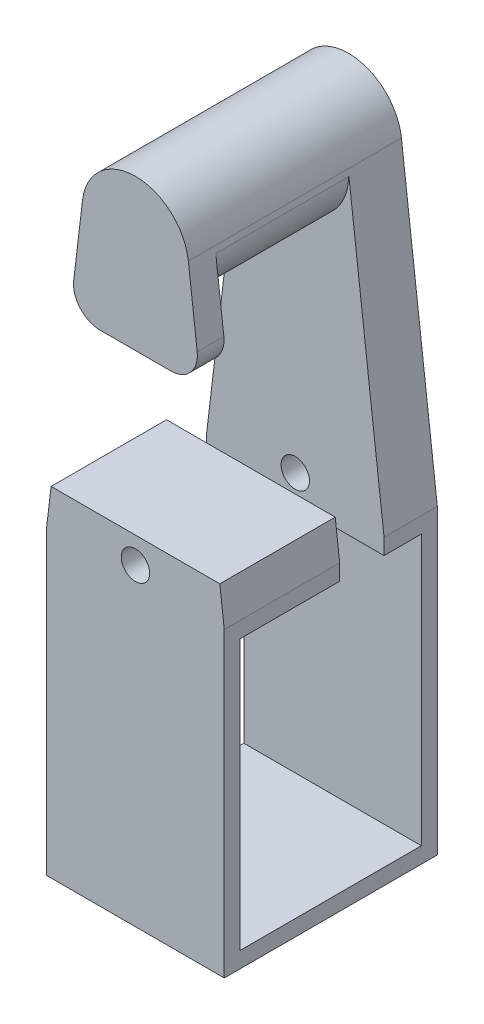
ISO-10303-21;
HEADER;
FILE_DESCRIPTION(('STEP AP214'),'2;1');
FILE_NAME('part.step','',(''),(''),'','','');
FILE_SCHEMA(('AUTOMOTIVE_DESIGN { 1 0 10303 214 1 1 1 1 }'));
ENDSEC;
DATA;
#1=APPLICATION_CONTEXT('core data for automotive mechanical design processes');
#2=APPLICATION_PROTOCOL_DEFINITION('international standard','automotive_design',2000,#1);
#3=PRODUCT_CONTEXT('',#1,'mechanical');
#4=PRODUCT('Part','Part','',(#3));
#5=PRODUCT_RELATED_PRODUCT_CATEGORY('part','',(#4));
#6=PRODUCT_DEFINITION_FORMATION('','',#4);
#7=PRODUCT_DEFINITION_CONTEXT('part definition',#1,'design');
#8=PRODUCT_DEFINITION('design','',#6,#7);
#9=PRODUCT_DEFINITION_SHAPE('','',#8);
#10=(LENGTH_UNIT() NAMED_UNIT(*) SI_UNIT(.MILLI.,.METRE.));
#11=(NAMED_UNIT(*) PLANE_ANGLE_UNIT() SI_UNIT($,.RADIAN.));
#12=(NAMED_UNIT(*) SI_UNIT($,.STERADIAN.) SOLID_ANGLE_UNIT());
#13=UNCERTAINTY_MEASURE_WITH_UNIT(LENGTH_MEASURE(1.E-05),#10,'distance_accuracy_value','');
#14=(GEOMETRIC_REPRESENTATION_CONTEXT(3) GLOBAL_UNCERTAINTY_ASSIGNED_CONTEXT((#13)) GLOBAL_UNIT_ASSIGNED_CONTEXT((#10,
#11,#12)) REPRESENTATION_CONTEXT('',''));
#15=CARTESIAN_POINT('',(0.,0.,0.));
#16=DIRECTION('',(0.,0.,1.));
#17=DIRECTION('',(1.,0.,0.));
#18=AXIS2_PLACEMENT_3D('',#15,#16,#17);
#19=CARTESIAN_POINT('',(20.,34.,24.));
#20=DIRECTION('',(-0.992969639874625,-0.118369313114747,0.));
#21=DIRECTION('',(0.118369313114747,-0.992969639874625,0.));
#22=AXIS2_PLACEMENT_3D('',#19,#20,#21);
#23=PLANE('',#22);
#24=DIRECTION('',(-0.118369313114747,0.992969639874625,0.));
#25=VECTOR('',#24,1.);
#26=CARTESIAN_POINT('',(20.,34.,24.));
#27=LINE('',#26,#25);
#28=CARTESIAN_POINT('',(16.9538083993465,59.553715714797,24.));
#29=VERTEX_POINT('',#28);
#30=CARTESIAN_POINT('',(15.9578178392477,67.9088236541412,24.));
#31=VERTEX_POINT('',#30);
#32=EDGE_CURVE('E318',#29,#31,#27,.T.);
#33=ORIENTED_EDGE('',*,*,#32,.F.);
#34=DIRECTION('',(0.,0.,-1.));
#35=VECTOR('',#34,1.);
#36=CARTESIAN_POINT('',(16.9538083993465,59.553715714797,24.));
#37=LINE('',#36,#35);
#38=CARTESIAN_POINT('',(16.9538083993465,59.553715714797,21.));
#39=VERTEX_POINT('',#38);
#40=EDGE_CURVE('E379',#29,#39,#37,.T.);
#41=ORIENTED_EDGE('',*,*,#40,.T.);
#42=DIRECTION('',(-0.118369313114747,0.992969639874625,0.));
#43=VECTOR('',#42,1.);
#44=CARTESIAN_POINT('',(20.,34.,21.));
#45=LINE('',#44,#43);
#46=CARTESIAN_POINT('',(16.0424808161885,67.1986077754528,21.));
#47=VERTEX_POINT('',#46);
#48=EDGE_CURVE('E304',#39,#47,#45,.T.);
#49=ORIENTED_EDGE('',*,*,#48,.T.);
#50=DIRECTION('',(0.,0.,1.));
#51=VECTOR('',#50,1.);
#52=CARTESIAN_POINT('',(16.0424808161885,67.1986077754528,24.));
#53=LINE('',#52,#51);
#54=CARTESIAN_POINT('',(16.0424808161885,67.1986077754528,6.00000000000001));
#55=VERTEX_POINT('',#54);
#56=EDGE_CURVE('E205',#55,#47,#53,.T.);
#57=ORIENTED_EDGE('',*,*,#56,.F.);
#58=DIRECTION('',(0.118369313114747,-0.992969639874625,0.));
#59=VECTOR('',#58,1.);
#60=CARTESIAN_POINT('',(20.,34.,6.));
#61=LINE('',#60,#59);
#62=CARTESIAN_POINT('',(20.,34.,6.));
#63=VERTEX_POINT('',#62);
#64=EDGE_CURVE('E302',#55,#63,#61,.T.);
#65=ORIENTED_EDGE('',*,*,#64,.T.);
#66=DIRECTION('',(0.,0.,-1.));
#67=VECTOR('',#66,1.);
#68=CARTESIAN_POINT('',(20.,34.,24.));
#69=LINE('',#68,#67);
#70=CARTESIAN_POINT('',(20.,34.,0.));
#71=VERTEX_POINT('',#70);
#72=EDGE_CURVE('E350',#63,#71,#69,.T.);
#73=ORIENTED_EDGE('',*,*,#72,.T.);
#74=DIRECTION('',(-0.118369313114747,0.992969639874625,0.));
#75=VECTOR('',#74,1.);
#76=CARTESIAN_POINT('',(20.,34.,0.));
#77=LINE('',#76,#75);
#78=CARTESIAN_POINT('',(15.9578178392477,67.9088236541412,0.));
#79=VERTEX_POINT('',#78);
#80=EDGE_CURVE('E335',#71,#79,#77,.T.);
#81=ORIENTED_EDGE('',*,*,#80,.T.);
#82=DIRECTION('',(0.,0.,-1.));
#83=VECTOR('',#82,1.);
#84=CARTESIAN_POINT('',(15.9578178392477,67.9088236541412,24.));
#85=LINE('',#84,#83);
#86=EDGE_CURVE('E347',#31,#79,#85,.T.);
#87=ORIENTED_EDGE('',*,*,#86,.F.);
#88=EDGE_LOOP('',(#33,#41,#49,#57,#65,#73,#81,#87));
#89=FACE_BOUND('',#88,.T.);
#90=ADVANCED_FACE('F35',(#89),#23,.F.);
#91=CARTESIAN_POINT('',(0.,34.,24.));
#92=DIRECTION('',(0.992969639874625,-0.118369313114747,0.));
#93=DIRECTION('',(0.118369313114747,0.992969639874625,0.));
#94=AXIS2_PLACEMENT_3D('',#91,#92,#93);
#95=PLANE('',#94);
#96=DIRECTION('',(-0.118369313114747,-0.992969639874625,0.));
#97=VECTOR('',#96,1.);
#98=CARTESIAN_POINT('',(0.,34.,21.));
#99=LINE('',#98,#97);
#100=CARTESIAN_POINT('',(3.95751918381153,67.1986077754528,21.));
#101=VERTEX_POINT('',#100);
#102=CARTESIAN_POINT('',(3.04619160065353,59.553715714797,21.));
#103=VERTEX_POINT('',#102);
#104=EDGE_CURVE('E367',#101,#103,#99,.T.);
#105=ORIENTED_EDGE('',*,*,#104,.T.);
#106=DIRECTION('',(0.,0.,1.));
#107=VECTOR('',#106,1.);
#108=CARTESIAN_POINT('',(3.04619160065353,59.553715714797,24.));
#109=LINE('',#108,#107);
#110=CARTESIAN_POINT('',(3.04619160065353,59.553715714797,24.));
#111=VERTEX_POINT('',#110);
#112=EDGE_CURVE('E11',#103,#111,#109,.T.);
#113=ORIENTED_EDGE('',*,*,#112,.T.);
#114=DIRECTION('',(-0.118369313114747,-0.992969639874625,0.));
#115=VECTOR('',#114,1.);
#116=CARTESIAN_POINT('',(0.,34.,24.));
#117=LINE('',#116,#115);
#118=CARTESIAN_POINT('',(4.04218216075225,67.9088236541412,24.));
#119=VERTEX_POINT('',#118);
#120=EDGE_CURVE('E325',#119,#111,#117,.T.);
#121=ORIENTED_EDGE('',*,*,#120,.F.);
#122=DIRECTION('',(0.,0.,-1.));
#123=VECTOR('',#122,1.);
#124=CARTESIAN_POINT('',(4.04218216075225,67.9088236541412,24.));
#125=LINE('',#124,#123);
#126=CARTESIAN_POINT('',(4.04218216075225,67.9088236541412,0.));
#127=VERTEX_POINT('',#126);
#128=EDGE_CURVE('E344',#119,#127,#125,.T.);
#129=ORIENTED_EDGE('',*,*,#128,.T.);
#130=DIRECTION('',(-0.118369313114747,-0.992969639874625,0.));
#131=VECTOR('',#130,1.);
#132=CARTESIAN_POINT('',(0.,34.,0.));
#133=LINE('',#132,#131);
#134=CARTESIAN_POINT('',(0.,34.,0.));
#135=VERTEX_POINT('',#134);
#136=EDGE_CURVE('E314',#127,#135,#133,.T.);
#137=ORIENTED_EDGE('',*,*,#136,.T.);
#138=DIRECTION('',(0.,0.,-1.));
#139=VECTOR('',#138,1.);
#140=CARTESIAN_POINT('',(0.,34.,24.));
#141=LINE('',#140,#139);
#142=CARTESIAN_POINT('',(0.,34.,6.));
#143=VERTEX_POINT('',#142);
#144=EDGE_CURVE('E327',#143,#135,#141,.T.);
#145=ORIENTED_EDGE('',*,*,#144,.F.);
#146=DIRECTION('',(0.118369313114747,0.992969639874625,0.));
#147=VECTOR('',#146,1.);
#148=CARTESIAN_POINT('',(0.,34.,6.));
#149=LINE('',#148,#147);
#150=CARTESIAN_POINT('',(3.95751918381153,67.1986077754528,6.00000000000001));
#151=VERTEX_POINT('',#150);
#152=EDGE_CURVE('E365',#143,#151,#149,.T.);
#153=ORIENTED_EDGE('',*,*,#152,.T.);
#154=DIRECTION('',(0.,0.,-1.));
#155=VECTOR('',#154,1.);
#156=CARTESIAN_POINT('',(3.95751918381153,67.1986077754528,24.));
#157=LINE('',#156,#155);
#158=EDGE_CURVE('E373',#101,#151,#157,.T.);
#159=ORIENTED_EDGE('',*,*,#158,.F.);
#160=EDGE_LOOP('',(#105,#113,#121,#129,#137,#145,#153,#159));
#161=FACE_BOUND('',#160,.T.);
#162=ADVANCED_FACE('F406',(#161),#95,.F.);
#163=CARTESIAN_POINT('',(20.,34.,24.));
#164=VERTEX_POINT('',#163);
#165=CARTESIAN_POINT('',(20.,34.,11.));
#166=VERTEX_POINT('',#165);
#167=EDGE_CURVE('E351',#164,#166,#69,.T.);
#168=ORIENTED_EDGE('',*,*,#167,.T.);
#169=DIRECTION('',(-0.118369313114747,0.992969639874625,0.));
#170=VECTOR('',#169,1.);
#171=CARTESIAN_POINT('',(20.,34.,11.));
#172=LINE('',#171,#170);
#173=CARTESIAN_POINT('',(19.4993289873951,38.2,11.));
#174=VERTEX_POINT('',#173);
#175=EDGE_CURVE('E306',#166,#174,#172,.T.);
#176=ORIENTED_EDGE('',*,*,#175,.T.);
#177=DIRECTION('',(0.,0.,1.));
#178=VECTOR('',#177,1.);
#179=CARTESIAN_POINT('',(19.4993289873951,38.2,24.));
#180=LINE('',#179,#178);
#181=CARTESIAN_POINT('',(19.4993289873951,38.2,24.));
#182=VERTEX_POINT('',#181);
#183=EDGE_CURVE('E300',#174,#182,#180,.T.);
#184=ORIENTED_EDGE('',*,*,#183,.T.);
#185=EDGE_CURVE('E319',#164,#182,#27,.T.);
#186=ORIENTED_EDGE('',*,*,#185,.F.);
#187=EDGE_LOOP('',(#168,#176,#184,#186));
#188=FACE_BOUND('',#187,.T.);
#189=ADVANCED_FACE('F466',(#188),#23,.F.);
#190=DIRECTION('',(0.,0.,-1.));
#191=VECTOR('',#190,1.);
#192=CARTESIAN_POINT('',(0.500671012604887,38.2,24.));
#193=LINE('',#192,#191);
#194=CARTESIAN_POINT('',(0.500671012604887,38.2,24.));
#195=VERTEX_POINT('',#194);
#196=CARTESIAN_POINT('',(0.500671012604887,38.2,11.));
#197=VERTEX_POINT('',#196);
#198=EDGE_CURVE('E282',#195,#197,#193,.T.);
#199=ORIENTED_EDGE('',*,*,#198,.T.);
#200=DIRECTION('',(-0.118369313114747,-0.992969639874625,0.));
#201=VECTOR('',#200,1.);
#202=CARTESIAN_POINT('',(0.,34.,11.));
#203=LINE('',#202,#201);
#204=CARTESIAN_POINT('',(0.,34.,11.));
#205=VERTEX_POINT('',#204);
#206=EDGE_CURVE('E370',#197,#205,#203,.T.);
#207=ORIENTED_EDGE('',*,*,#206,.T.);
#208=CARTESIAN_POINT('',(0.,34.,24.));
#209=VERTEX_POINT('',#208);
#210=EDGE_CURVE('E341',#209,#205,#141,.T.);
#211=ORIENTED_EDGE('',*,*,#210,.F.);
#212=EDGE_CURVE('E324',#195,#209,#117,.T.);
#213=ORIENTED_EDGE('',*,*,#212,.F.);
#214=EDGE_LOOP('',(#199,#207,#211,#213));
#215=FACE_BOUND('',#214,.T.);
#216=ADVANCED_FACE('F487',(#215),#95,.F.);
#217=CARTESIAN_POINT('',(10.,67.1986077754528,24.));
#218=DIRECTION('',(0.,0.,1.));
#219=DIRECTION('',(1.,0.,0.));
#220=AXIS2_PLACEMENT_3D('',#217,#218,#219);
#221=PLANE('',#220);
#222=CARTESIAN_POINT('',(10.,35.2695656027322,24.));
#223=DIRECTION('',(0.,0.,1.));
#224=DIRECTION('',(1.,0.,0.));
#225=AXIS2_PLACEMENT_3D('',#222,#223,#224);
#226=CIRCLE('',#225,1.6);
#227=CARTESIAN_POINT('',(11.6,35.2695656027322,24.));
#228=VERTEX_POINT('',#227);
#229=EDGE_CURVE('E232',#228,#228,#226,.T.);
#230=ORIENTED_EDGE('',*,*,#229,.F.);
#231=EDGE_LOOP('',(#230));
#232=FACE_BOUND('',#231,.T.);
#233=DIRECTION('',(1.,0.,0.));
#234=VECTOR('',#233,1.);
#235=CARTESIAN_POINT('',(10.,38.2,24.));
#236=LINE('',#235,#234);
#237=EDGE_CURVE('E362',#195,#182,#236,.T.);
#238=ORIENTED_EDGE('',*,*,#237,.F.);
#239=ORIENTED_EDGE('',*,*,#212,.T.);
#240=DIRECTION('',(0.,-1.,0.));
#241=VECTOR('',#240,1.);
#242=CARTESIAN_POINT('',(0.,0.,24.));
#243=LINE('',#242,#241);
#244=CARTESIAN_POINT('',(0.,0.,24.));
#245=VERTEX_POINT('',#244);
#246=EDGE_CURVE('E310',#209,#245,#243,.T.);
#247=ORIENTED_EDGE('',*,*,#246,.T.);
#248=DIRECTION('',(1.,0.,0.));
#249=VECTOR('',#248,1.);
#250=CARTESIAN_POINT('',(0.,0.,24.));
#251=LINE('',#250,#249);
#252=CARTESIAN_POINT('',(20.,0.,24.));
#253=VERTEX_POINT('',#252);
#254=EDGE_CURVE('E313',#245,#253,#251,.T.);
#255=ORIENTED_EDGE('',*,*,#254,.T.);
#256=DIRECTION('',(0.,1.,0.));
#257=VECTOR('',#256,1.);
#258=CARTESIAN_POINT('',(20.,0.,24.));
#259=LINE('',#258,#257);
#260=EDGE_CURVE('E316',#253,#164,#259,.T.);
#261=ORIENTED_EDGE('',*,*,#260,.T.);
#262=ORIENTED_EDGE('',*,*,#185,.T.);
#263=EDGE_LOOP('',(#238,#239,#247,#255,#261,#262));
#264=FACE_BOUND('',#263,.T.);
#265=ADVANCED_FACE('F470',(#232,#264),#221,.T.);
#266=CARTESIAN_POINT('',(0.,0.,24.));
#267=DIRECTION('',(1.,0.,0.));
#268=DIRECTION('',(0.,0.,-1.));
#269=AXIS2_PLACEMENT_3D('',#266,#267,#268);
#270=PLANE('',#269);
#271=ORIENTED_EDGE('',*,*,#210,.T.);
#272=DIRECTION('',(0.,-1.,0.));
#273=VECTOR('',#272,1.);
#274=CARTESIAN_POINT('',(0.,38.2,11.));
#275=LINE('',#274,#273);
#276=CARTESIAN_POINT('',(0.,32.2,11.));
#277=VERTEX_POINT('',#276);
#278=EDGE_CURVE('E255',#205,#277,#275,.T.);
#279=ORIENTED_EDGE('',*,*,#278,.T.);
#280=DIRECTION('',(0.,0.,1.));
#281=VECTOR('',#280,1.);
#282=CARTESIAN_POINT('',(0.,32.2,22.2));
#283=LINE('',#282,#281);
#284=CARTESIAN_POINT('',(0.,32.2,22.2));
#285=VERTEX_POINT('',#284);
#286=EDGE_CURVE('E258',#277,#285,#283,.T.);
#287=ORIENTED_EDGE('',*,*,#286,.T.);
#288=DIRECTION('',(0.,-1.,0.));
#289=VECTOR('',#288,1.);
#290=CARTESIAN_POINT('',(0.,32.2,22.2));
#291=LINE('',#290,#289);
#292=CARTESIAN_POINT('',(0.,1.8,22.2));
#293=VERTEX_POINT('',#292);
#294=EDGE_CURVE('E239',#285,#293,#291,.T.);
#295=ORIENTED_EDGE('',*,*,#294,.T.);
#296=DIRECTION('',(0.,0.,-1.));
#297=VECTOR('',#296,1.);
#298=CARTESIAN_POINT('',(0.,1.8,22.2));
#299=LINE('',#298,#297);
#300=CARTESIAN_POINT('',(0.,1.8,1.8));
#301=VERTEX_POINT('',#300);
#302=EDGE_CURVE('E242',#293,#301,#299,.T.);
#303=ORIENTED_EDGE('',*,*,#302,.T.);
#304=DIRECTION('',(0.,1.,0.));
#305=VECTOR('',#304,1.);
#306=CARTESIAN_POINT('',(0.,32.2,1.8));
#307=LINE('',#306,#305);
#308=CARTESIAN_POINT('',(0.,32.2,1.8));
#309=VERTEX_POINT('',#308);
#310=EDGE_CURVE('E246',#301,#309,#307,.T.);
#311=ORIENTED_EDGE('',*,*,#310,.T.);
#312=DIRECTION('',(0.,0.,1.));
#313=VECTOR('',#312,1.);
#314=CARTESIAN_POINT('',(0.,32.2,6.));
#315=LINE('',#314,#313);
#316=CARTESIAN_POINT('',(0.,32.2,6.));
#317=VERTEX_POINT('',#316);
#318=EDGE_CURVE('E249',#309,#317,#315,.T.);
#319=ORIENTED_EDGE('',*,*,#318,.T.);
#320=DIRECTION('',(0.,1.,0.));
#321=VECTOR('',#320,1.);
#322=CARTESIAN_POINT('',(0.,38.2,6.));
#323=LINE('',#322,#321);
#324=EDGE_CURVE('E252',#317,#143,#323,.T.);
#325=ORIENTED_EDGE('',*,*,#324,.T.);
#326=ORIENTED_EDGE('',*,*,#144,.T.);
#327=DIRECTION('',(0.,-1.,0.));
#328=VECTOR('',#327,1.);
#329=CARTESIAN_POINT('',(0.,0.,0.));
#330=LINE('',#329,#328);
#331=CARTESIAN_POINT('',(0.,0.,0.));
#332=VERTEX_POINT('',#331);
#333=EDGE_CURVE('E309',#135,#332,#330,.T.);
#334=ORIENTED_EDGE('',*,*,#333,.T.);
#335=DIRECTION('',(0.,0.,-1.));
#336=VECTOR('',#335,1.);
#337=CARTESIAN_POINT('',(0.,0.,24.));
#338=LINE('',#337,#336);
#339=EDGE_CURVE('E357',#245,#332,#338,.T.);
#340=ORIENTED_EDGE('',*,*,#339,.F.);
#341=ORIENTED_EDGE('',*,*,#246,.F.);
#342=EDGE_LOOP('',(#271,#279,#287,#295,#303,#311,#319,#325,#326,#334,#340,#341));
#343=FACE_BOUND('',#342,.T.);
#344=ADVANCED_FACE('F439',(#343),#270,.F.);
#345=CARTESIAN_POINT('',(0.,0.,24.));
#346=DIRECTION('',(0.,1.,0.));
#347=DIRECTION('',(0.,0.,1.));
#348=AXIS2_PLACEMENT_3D('',#345,#346,#347);
#349=PLANE('',#348);
#350=DIRECTION('',(1.,0.,0.));
#351=VECTOR('',#350,1.);
#352=CARTESIAN_POINT('',(0.,0.,0.));
#353=LINE('',#352,#351);
#354=CARTESIAN_POINT('',(20.,0.,0.));
#355=VERTEX_POINT('',#354);
#356=EDGE_CURVE('E330',#332,#355,#353,.T.);
#357=ORIENTED_EDGE('',*,*,#356,.T.);
#358=DIRECTION('',(0.,0.,-1.));
#359=VECTOR('',#358,1.);
#360=CARTESIAN_POINT('',(20.,0.,24.));
#361=LINE('',#360,#359);
#362=EDGE_CURVE('E354',#253,#355,#361,.T.);
#363=ORIENTED_EDGE('',*,*,#362,.F.);
#364=ORIENTED_EDGE('',*,*,#254,.F.);
#365=ORIENTED_EDGE('',*,*,#339,.T.);
#366=EDGE_LOOP('',(#357,#363,#364,#365));
#367=FACE_BOUND('',#366,.T.);
#368=ADVANCED_FACE('F472',(#367),#349,.F.);
#369=CARTESIAN_POINT('',(20.,0.,24.));
#370=DIRECTION('',(-1.,0.,0.));
#371=DIRECTION('',(0.,0.,1.));
#372=AXIS2_PLACEMENT_3D('',#369,#370,#371);
#373=PLANE('',#372);
#374=DIRECTION('',(0.,0.,1.));
#375=VECTOR('',#374,1.);
#376=CARTESIAN_POINT('',(20.,32.2,22.2));
#377=LINE('',#376,#375);
#378=CARTESIAN_POINT('',(20.,32.2,11.));
#379=VERTEX_POINT('',#378);
#380=CARTESIAN_POINT('',(20.,32.2,22.2));
#381=VERTEX_POINT('',#380);
#382=EDGE_CURVE('E243',#379,#381,#377,.T.);
#383=ORIENTED_EDGE('',*,*,#382,.F.);
#384=DIRECTION('',(0.,-1.,0.));
#385=VECTOR('',#384,1.);
#386=CARTESIAN_POINT('',(20.,38.2,11.));
#387=LINE('',#386,#385);
#388=EDGE_CURVE('E276',#166,#379,#387,.T.);
#389=ORIENTED_EDGE('',*,*,#388,.F.);
#390=ORIENTED_EDGE('',*,*,#167,.F.);
#391=ORIENTED_EDGE('',*,*,#260,.F.);
#392=ORIENTED_EDGE('',*,*,#362,.T.);
#393=DIRECTION('',(0.,1.,0.));
#394=VECTOR('',#393,1.);
#395=CARTESIAN_POINT('',(20.,0.,0.));
#396=LINE('',#395,#394);
#397=EDGE_CURVE('E332',#355,#71,#396,.T.);
#398=ORIENTED_EDGE('',*,*,#397,.T.);
#399=ORIENTED_EDGE('',*,*,#72,.F.);
#400=DIRECTION('',(0.,1.,0.));
#401=VECTOR('',#400,1.);
#402=CARTESIAN_POINT('',(20.,38.2,6.));
#403=LINE('',#402,#401);
#404=CARTESIAN_POINT('',(20.,32.2,6.));
#405=VERTEX_POINT('',#404);
#406=EDGE_CURVE('E273',#405,#63,#403,.T.);
#407=ORIENTED_EDGE('',*,*,#406,.F.);
#408=DIRECTION('',(0.,0.,1.));
#409=VECTOR('',#408,1.);
#410=CARTESIAN_POINT('',(20.,32.2,6.));
#411=LINE('',#410,#409);
#412=CARTESIAN_POINT('',(20.,32.2,1.8));
#413=VERTEX_POINT('',#412);
#414=EDGE_CURVE('E270',#413,#405,#411,.T.);
#415=ORIENTED_EDGE('',*,*,#414,.F.);
#416=DIRECTION('',(0.,1.,0.));
#417=VECTOR('',#416,1.);
#418=CARTESIAN_POINT('',(20.,32.2,1.8));
#419=LINE('',#418,#417);
#420=CARTESIAN_POINT('',(20.,1.8,1.8));
#421=VERTEX_POINT('',#420);
#422=EDGE_CURVE('E267',#421,#413,#419,.T.);
#423=ORIENTED_EDGE('',*,*,#422,.F.);
#424=DIRECTION('',(0.,0.,-1.));
#425=VECTOR('',#424,1.);
#426=CARTESIAN_POINT('',(20.,1.8,22.2));
#427=LINE('',#426,#425);
#428=CARTESIAN_POINT('',(20.,1.8,22.2));
#429=VERTEX_POINT('',#428);
#430=EDGE_CURVE('E264',#429,#421,#427,.T.);
#431=ORIENTED_EDGE('',*,*,#430,.F.);
#432=DIRECTION('',(0.,-1.,0.));
#433=VECTOR('',#432,1.);
#434=CARTESIAN_POINT('',(20.,32.2,22.2));
#435=LINE('',#434,#433);
#436=EDGE_CURVE('E238',#381,#429,#435,.T.);
#437=ORIENTED_EDGE('',*,*,#436,.F.);
#438=EDGE_LOOP('',(#383,#389,#390,#391,#392,#398,#399,#407,#415,#423,#431,#437));
#439=FACE_BOUND('',#438,.T.);
#440=ADVANCED_FACE('F424',(#439),#373,.F.);
#441=CARTESIAN_POINT('',(10.,67.1986077754528,24.));
#442=DIRECTION('',(0.,0.,-1.));
#443=DIRECTION('',(-1.,0.,0.));
#444=AXIS2_PLACEMENT_3D('',#441,#442,#443);
#445=CYLINDRICAL_SURFACE('',#444,6.);
#446=CARTESIAN_POINT('',(10.,67.1986077754528,0.));
#447=DIRECTION('',(0.,0.,1.));
#448=DIRECTION('',(1.,0.,0.));
#449=AXIS2_PLACEMENT_3D('',#446,#447,#448);
#450=CIRCLE('',#449,6.);
#451=EDGE_CURVE('E337',#79,#127,#450,.T.);
#452=ORIENTED_EDGE('',*,*,#451,.T.);
#453=ORIENTED_EDGE('',*,*,#128,.F.);
#454=CARTESIAN_POINT('',(10.,67.1986077754528,24.));
#455=DIRECTION('',(0.,0.,1.));
#456=DIRECTION('',(1.,0.,0.));
#457=AXIS2_PLACEMENT_3D('',#454,#455,#456);
#458=CIRCLE('',#457,6.);
#459=EDGE_CURVE('E322',#31,#119,#458,.T.);
#460=ORIENTED_EDGE('',*,*,#459,.F.);
#461=ORIENTED_EDGE('',*,*,#86,.T.);
#462=EDGE_LOOP('',(#452,#453,#460,#461));
#463=FACE_BOUND('',#462,.T.);
#464=ADVANCED_FACE('F435',(#463),#445,.T.);
#465=DIRECTION('',(-1.,0.,0.));
#466=VECTOR('',#465,1.);
#467=CARTESIAN_POINT('',(10.,56.1986077754528,24.));
#468=LINE('',#467,#466);
#469=CARTESIAN_POINT('',(13.9748994797226,56.1986077754528,24.));
#470=VERTEX_POINT('',#469);
#471=CARTESIAN_POINT('',(6.02510052027741,56.1986077754528,24.));
#472=VERTEX_POINT('',#471);
#473=EDGE_CURVE('E360',#470,#472,#468,.T.);
#474=ORIENTED_EDGE('',*,*,#473,.F.);
#475=CARTESIAN_POINT('',(13.9748994797226,59.1986077754528,24.));
#476=DIRECTION('',(0.,0.,1.));
#477=DIRECTION('',(1.,0.,0.));
#478=AXIS2_PLACEMENT_3D('',#475,#476,#477);
#479=CIRCLE('',#478,3.);
#480=EDGE_CURVE('E43',#470,#29,#479,.T.);
#481=ORIENTED_EDGE('',*,*,#480,.T.);
#482=ORIENTED_EDGE('',*,*,#32,.T.);
#483=ORIENTED_EDGE('',*,*,#459,.T.);
#484=ORIENTED_EDGE('',*,*,#120,.T.);
#485=CARTESIAN_POINT('',(6.02510052027741,59.1986077754528,24.));
#486=DIRECTION('',(0.,0.,1.));
#487=DIRECTION('',(1.,0.,0.));
#488=AXIS2_PLACEMENT_3D('',#485,#486,#487);
#489=CIRCLE('',#488,3.);
#490=EDGE_CURVE('E50',#111,#472,#489,.T.);
#491=ORIENTED_EDGE('',*,*,#490,.T.);
#492=EDGE_LOOP('',(#474,#481,#482,#483,#484,#491));
#493=FACE_BOUND('',#492,.T.);
#494=ADVANCED_FACE('F392',(#493),#221,.T.);
#495=CARTESIAN_POINT('',(10.,67.1986077754528,0.));
#496=DIRECTION('',(0.,0.,1.));
#497=DIRECTION('',(1.,0.,0.));
#498=AXIS2_PLACEMENT_3D('',#495,#496,#497);
#499=PLANE('',#498);
#500=CARTESIAN_POINT('',(10.,35.2695656027322,0.));
#501=DIRECTION('',(0.,0.,1.));
#502=DIRECTION('',(1.,0.,0.));
#503=AXIS2_PLACEMENT_3D('',#500,#501,#502);
#504=CIRCLE('',#503,1.6);
#505=CARTESIAN_POINT('',(11.6,35.2695656027322,0.));
#506=VERTEX_POINT('',#505);
#507=EDGE_CURVE('E228',#506,#506,#504,.T.);
#508=ORIENTED_EDGE('',*,*,#507,.T.);
#509=EDGE_LOOP('',(#508));
#510=FACE_BOUND('',#509,.T.);
#511=ORIENTED_EDGE('',*,*,#333,.F.);
#512=ORIENTED_EDGE('',*,*,#136,.F.);
#513=ORIENTED_EDGE('',*,*,#451,.F.);
#514=ORIENTED_EDGE('',*,*,#80,.F.);
#515=ORIENTED_EDGE('',*,*,#397,.F.);
#516=ORIENTED_EDGE('',*,*,#356,.F.);
#517=EDGE_LOOP('',(#511,#512,#513,#514,#515,#516));
#518=FACE_BOUND('',#517,.T.);
#519=ADVANCED_FACE('F432',(#510,#518),#499,.F.);
#520=CARTESIAN_POINT('',(0.,38.2,11.));
#521=DIRECTION('',(0.,0.,1.));
#522=DIRECTION('',(1.,0.,0.));
#523=AXIS2_PLACEMENT_3D('',#520,#521,#522);
#524=PLANE('',#523);
#525=CARTESIAN_POINT('',(10.,35.2695656027322,11.));
#526=DIRECTION('',(0.,0.,1.));
#527=DIRECTION('',(1.,0.,0.));
#528=AXIS2_PLACEMENT_3D('',#525,#526,#527);
#529=CIRCLE('',#528,1.6);
#530=CARTESIAN_POINT('',(11.6,35.2695656027322,11.));
#531=VERTEX_POINT('',#530);
#532=EDGE_CURVE('E235',#531,#531,#529,.T.);
#533=ORIENTED_EDGE('',*,*,#532,.T.);
#534=EDGE_LOOP('',(#533));
#535=FACE_BOUND('',#534,.T.);
#536=ORIENTED_EDGE('',*,*,#388,.T.);
#537=DIRECTION('',(1.,0.,0.));
#538=VECTOR('',#537,1.);
#539=CARTESIAN_POINT('',(0.,32.2,11.));
#540=LINE('',#539,#538);
#541=EDGE_CURVE('E283',#277,#379,#540,.T.);
#542=ORIENTED_EDGE('',*,*,#541,.F.);
#543=ORIENTED_EDGE('',*,*,#278,.F.);
#544=ORIENTED_EDGE('',*,*,#206,.F.);
#545=DIRECTION('',(1.,0.,0.));
#546=VECTOR('',#545,1.);
#547=CARTESIAN_POINT('',(0.,38.2,11.));
#548=LINE('',#547,#546);
#549=EDGE_CURVE('E286',#197,#174,#548,.T.);
#550=ORIENTED_EDGE('',*,*,#549,.T.);
#551=ORIENTED_EDGE('',*,*,#175,.F.);
#552=EDGE_LOOP('',(#536,#542,#543,#544,#550,#551));
#553=FACE_BOUND('',#552,.T.);
#554=ADVANCED_FACE('F462',(#535,#553),#524,.F.);
#555=CARTESIAN_POINT('',(0.,61.1986077754527,21.));
#556=DIRECTION('',(0.,0.,1.));
#557=DIRECTION('',(1.,0.,0.));
#558=AXIS2_PLACEMENT_3D('',#555,#556,#557);
#559=PLANE('',#558);
#560=ORIENTED_EDGE('',*,*,#48,.F.);
#561=CARTESIAN_POINT('',(13.9748994797226,59.1986077754528,21.));
#562=DIRECTION('',(0.,0.,1.));
#563=DIRECTION('',(1.,0.,0.));
#564=AXIS2_PLACEMENT_3D('',#561,#562,#563);
#565=CIRCLE('',#564,3.);
#566=CARTESIAN_POINT('',(13.9748994797226,56.1986077754528,21.));
#567=VERTEX_POINT('',#566);
#568=EDGE_CURVE('E384',#39,#567,#565,.F.);
#569=ORIENTED_EDGE('',*,*,#568,.T.);
#570=DIRECTION('',(1.,0.,0.));
#571=VECTOR('',#570,1.);
#572=CARTESIAN_POINT('',(0.,56.1986077754528,21.));
#573=LINE('',#572,#571);
#574=CARTESIAN_POINT('',(6.02510052027741,56.1986077754528,21.));
#575=VERTEX_POINT('',#574);
#576=EDGE_CURVE('E289',#575,#567,#573,.T.);
#577=ORIENTED_EDGE('',*,*,#576,.F.);
#578=CARTESIAN_POINT('',(6.02510052027741,59.1986077754528,21.));
#579=DIRECTION('',(0.,0.,1.));
#580=DIRECTION('',(1.,0.,0.));
#581=AXIS2_PLACEMENT_3D('',#578,#579,#580);
#582=CIRCLE('',#581,3.);
#583=EDGE_CURVE('E382',#575,#103,#582,.F.);
#584=ORIENTED_EDGE('',*,*,#583,.T.);
#585=ORIENTED_EDGE('',*,*,#104,.F.);
#586=DIRECTION('',(-1.,0.,0.));
#587=VECTOR('',#586,1.);
#588=CARTESIAN_POINT('',(0.500671012604887,67.1986077754528,21.));
#589=LINE('',#588,#587);
#590=CARTESIAN_POINT('',(4.,67.1986077754528,21.));
#591=VERTEX_POINT('',#590);
#592=EDGE_CURVE('E214',#591,#101,#589,.T.);
#593=ORIENTED_EDGE('',*,*,#592,.F.);
#594=CARTESIAN_POINT('',(10.,67.1986077754528,21.));
#595=DIRECTION('',(0.,0.,1.));
#596=DIRECTION('',(1.,0.,0.));
#597=AXIS2_PLACEMENT_3D('',#594,#595,#596);
#598=CIRCLE('',#597,6.);
#599=CARTESIAN_POINT('',(16.,67.1986077754528,21.));
#600=VERTEX_POINT('',#599);
#601=EDGE_CURVE('E208',#600,#591,#598,.F.);
#602=ORIENTED_EDGE('',*,*,#601,.F.);
#603=DIRECTION('',(-1.,0.,0.));
#604=VECTOR('',#603,1.);
#605=CARTESIAN_POINT('',(16.,67.1986077754528,21.));
#606=LINE('',#605,#604);
#607=EDGE_CURVE('E197',#47,#600,#606,.T.);
#608=ORIENTED_EDGE('',*,*,#607,.F.);
#609=EDGE_LOOP('',(#560,#569,#577,#584,#585,#593,#602,#608));
#610=FACE_BOUND('',#609,.T.);
#611=ADVANCED_FACE('F212',(#610),#559,.F.);
#612=CARTESIAN_POINT('',(0.,38.2,6.));
#613=DIRECTION('',(0.,0.,-1.));
#614=DIRECTION('',(0.,1.,0.));
#615=AXIS2_PLACEMENT_3D('',#612,#613,#614);
#616=PLANE('',#615);
#617=DIRECTION('',(-1.,0.,0.));
#618=VECTOR('',#617,1.);
#619=CARTESIAN_POINT('',(0.500671012604887,67.1986077754528,6.));
#620=LINE('',#619,#618);
#621=CARTESIAN_POINT('',(4.,67.1986077754528,6.));
#622=VERTEX_POINT('',#621);
#623=EDGE_CURVE('E209',#622,#151,#620,.T.);
#624=ORIENTED_EDGE('',*,*,#623,.T.);
#625=ORIENTED_EDGE('',*,*,#152,.F.);
#626=ORIENTED_EDGE('',*,*,#324,.F.);
#627=DIRECTION('',(1.,0.,0.));
#628=VECTOR('',#627,1.);
#629=CARTESIAN_POINT('',(0.,32.2,6.));
#630=LINE('',#629,#628);
#631=EDGE_CURVE('E292',#317,#405,#630,.T.);
#632=ORIENTED_EDGE('',*,*,#631,.T.);
#633=ORIENTED_EDGE('',*,*,#406,.T.);
#634=ORIENTED_EDGE('',*,*,#64,.F.);
#635=DIRECTION('',(-1.,0.,0.));
#636=VECTOR('',#635,1.);
#637=CARTESIAN_POINT('',(16.,67.1986077754528,6.));
#638=LINE('',#637,#636);
#639=CARTESIAN_POINT('',(16.,67.1986077754528,6.));
#640=VERTEX_POINT('',#639);
#641=EDGE_CURVE('E221',#55,#640,#638,.T.);
#642=ORIENTED_EDGE('',*,*,#641,.T.);
#643=CARTESIAN_POINT('',(10.,67.1986077754528,6.));
#644=DIRECTION('',(0.,0.,-1.));
#645=DIRECTION('',(1.,0.,0.));
#646=AXIS2_PLACEMENT_3D('',#643,#644,#645);
#647=CIRCLE('',#646,6.);
#648=EDGE_CURVE('E220',#640,#622,#647,.T.);
#649=ORIENTED_EDGE('',*,*,#648,.T.);
#650=EDGE_LOOP('',(#624,#625,#626,#632,#633,#634,#642,#649));
#651=FACE_BOUND('',#650,.T.);
#652=CARTESIAN_POINT('',(10.,35.2695656027322,6.));
#653=DIRECTION('',(0.,0.,-1.));
#654=DIRECTION('',(0.,1.,0.));
#655=AXIS2_PLACEMENT_3D('',#652,#653,#654);
#656=CIRCLE('',#655,1.6);
#657=CARTESIAN_POINT('',(10.,36.8695656027322,6.));
#658=VERTEX_POINT('',#657);
#659=EDGE_CURVE('E231',#658,#658,#656,.T.);
#660=ORIENTED_EDGE('',*,*,#659,.T.);
#661=EDGE_LOOP('',(#660));
#662=FACE_BOUND('',#661,.T.);
#663=ADVANCED_FACE('F414',(#651,#662),#616,.F.);
#664=CARTESIAN_POINT('',(0.,38.2,24.));
#665=DIRECTION('',(0.,-1.,0.));
#666=DIRECTION('',(0.,0.,-1.));
#667=AXIS2_PLACEMENT_3D('',#664,#665,#666);
#668=PLANE('',#667);
#669=ORIENTED_EDGE('',*,*,#549,.F.);
#670=ORIENTED_EDGE('',*,*,#198,.F.);
#671=ORIENTED_EDGE('',*,*,#237,.T.);
#672=ORIENTED_EDGE('',*,*,#183,.F.);
#673=EDGE_LOOP('',(#669,#670,#671,#672));
#674=FACE_BOUND('',#673,.T.);
#675=ADVANCED_FACE('F520',(#674),#668,.F.);
#676=CARTESIAN_POINT('',(0.,56.1986077754528,21.));
#677=DIRECTION('',(0.,1.,0.));
#678=DIRECTION('',(0.,0.,1.));
#679=AXIS2_PLACEMENT_3D('',#676,#677,#678);
#680=PLANE('',#679);
#681=ORIENTED_EDGE('',*,*,#576,.T.);
#682=DIRECTION('',(0.,0.,-1.));
#683=VECTOR('',#682,1.);
#684=CARTESIAN_POINT('',(13.9748994797226,56.1986077754528,21.));
#685=LINE('',#684,#683);
#686=EDGE_CURVE('E388',#567,#470,#685,.F.);
#687=ORIENTED_EDGE('',*,*,#686,.T.);
#688=ORIENTED_EDGE('',*,*,#473,.T.);
#689=DIRECTION('',(0.,0.,1.));
#690=VECTOR('',#689,1.);
#691=CARTESIAN_POINT('',(6.02510052027741,56.1986077754528,21.));
#692=LINE('',#691,#690);
#693=EDGE_CURVE('E386',#472,#575,#692,.F.);
#694=ORIENTED_EDGE('',*,*,#693,.T.);
#695=EDGE_LOOP('',(#681,#687,#688,#694));
#696=FACE_BOUND('',#695,.T.);
#697=ADVANCED_FACE('F403',(#696),#680,.F.);
#698=CARTESIAN_POINT('',(0.,32.2,22.2));
#699=DIRECTION('',(0.,0.,1.));
#700=DIRECTION('',(0.,-1.,0.));
#701=AXIS2_PLACEMENT_3D('',#698,#699,#700);
#702=PLANE('',#701);
#703=ORIENTED_EDGE('',*,*,#436,.T.);
#704=DIRECTION('',(1.,0.,0.));
#705=VECTOR('',#704,1.);
#706=CARTESIAN_POINT('',(0.,1.8,22.2));
#707=LINE('',#706,#705);
#708=EDGE_CURVE('E261',#293,#429,#707,.T.);
#709=ORIENTED_EDGE('',*,*,#708,.F.);
#710=ORIENTED_EDGE('',*,*,#294,.F.);
#711=DIRECTION('',(1.,0.,0.));
#712=VECTOR('',#711,1.);
#713=CARTESIAN_POINT('',(0.,32.2,22.2));
#714=LINE('',#713,#712);
#715=EDGE_CURVE('E280',#285,#381,#714,.T.);
#716=ORIENTED_EDGE('',*,*,#715,.T.);
#717=EDGE_LOOP('',(#703,#709,#710,#716));
#718=FACE_BOUND('',#717,.T.);
#719=ADVANCED_FACE('F455',(#718),#702,.F.);
#720=CARTESIAN_POINT('',(0.,32.2,22.2));
#721=DIRECTION('',(0.,1.,0.));
#722=DIRECTION('',(0.,0.,1.));
#723=AXIS2_PLACEMENT_3D('',#720,#721,#722);
#724=PLANE('',#723);
#725=ORIENTED_EDGE('',*,*,#382,.T.);
#726=ORIENTED_EDGE('',*,*,#715,.F.);
#727=ORIENTED_EDGE('',*,*,#286,.F.);
#728=ORIENTED_EDGE('',*,*,#541,.T.);
#729=EDGE_LOOP('',(#725,#726,#727,#728));
#730=FACE_BOUND('',#729,.T.);
#731=ADVANCED_FACE('F459',(#730),#724,.F.);
#732=CARTESIAN_POINT('',(0.,32.2,6.));
#733=DIRECTION('',(0.,1.,0.));
#734=DIRECTION('',(0.,0.,1.));
#735=AXIS2_PLACEMENT_3D('',#732,#733,#734);
#736=PLANE('',#735);
#737=ORIENTED_EDGE('',*,*,#414,.T.);
#738=ORIENTED_EDGE('',*,*,#631,.F.);
#739=ORIENTED_EDGE('',*,*,#318,.F.);
#740=DIRECTION('',(1.,0.,0.));
#741=VECTOR('',#740,1.);
#742=CARTESIAN_POINT('',(0.,32.2,1.8));
#743=LINE('',#742,#741);
#744=EDGE_CURVE('E294',#309,#413,#743,.T.);
#745=ORIENTED_EDGE('',*,*,#744,.T.);
#746=EDGE_LOOP('',(#737,#738,#739,#745));
#747=FACE_BOUND('',#746,.T.);
#748=ADVANCED_FACE('F444',(#747),#736,.F.);
#749=CARTESIAN_POINT('',(0.,32.2,1.8));
#750=DIRECTION('',(0.,0.,-1.));
#751=DIRECTION('',(0.,1.,0.));
#752=AXIS2_PLACEMENT_3D('',#749,#750,#751);
#753=PLANE('',#752);
#754=ORIENTED_EDGE('',*,*,#422,.T.);
#755=ORIENTED_EDGE('',*,*,#744,.F.);
#756=ORIENTED_EDGE('',*,*,#310,.F.);
#757=DIRECTION('',(1.,0.,0.));
#758=VECTOR('',#757,1.);
#759=CARTESIAN_POINT('',(0.,1.8,1.8));
#760=LINE('',#759,#758);
#761=EDGE_CURVE('E296',#301,#421,#760,.T.);
#762=ORIENTED_EDGE('',*,*,#761,.T.);
#763=EDGE_LOOP('',(#754,#755,#756,#762));
#764=FACE_BOUND('',#763,.T.);
#765=ADVANCED_FACE('F449',(#764),#753,.F.);
#766=CARTESIAN_POINT('',(0.,1.8,22.2));
#767=DIRECTION('',(0.,-1.,0.));
#768=DIRECTION('',(0.,0.,-1.));
#769=AXIS2_PLACEMENT_3D('',#766,#767,#768);
#770=PLANE('',#769);
#771=ORIENTED_EDGE('',*,*,#430,.T.);
#772=ORIENTED_EDGE('',*,*,#761,.F.);
#773=ORIENTED_EDGE('',*,*,#302,.F.);
#774=ORIENTED_EDGE('',*,*,#708,.T.);
#775=EDGE_LOOP('',(#771,#772,#773,#774));
#776=FACE_BOUND('',#775,.T.);
#777=ADVANCED_FACE('F452',(#776),#770,.F.);
#778=CARTESIAN_POINT('',(10.,35.2695656027322,0.));
#779=DIRECTION('',(0.,0.,1.));
#780=DIRECTION('',(1.,0.,0.));
#781=AXIS2_PLACEMENT_3D('',#778,#779,#780);
#782=CYLINDRICAL_SURFACE('',#781,1.6);
#783=ORIENTED_EDGE('',*,*,#507,.F.);
#784=EDGE_LOOP('',(#783));
#785=FACE_BOUND('',#784,.T.);
#786=ORIENTED_EDGE('',*,*,#659,.F.);
#787=EDGE_LOOP('',(#786));
#788=FACE_BOUND('',#787,.T.);
#789=ADVANCED_FACE('F513',(#785,#788),#782,.F.);
#790=ORIENTED_EDGE('',*,*,#229,.T.);
#791=EDGE_LOOP('',(#790));
#792=FACE_BOUND('',#791,.T.);
#793=ORIENTED_EDGE('',*,*,#532,.F.);
#794=EDGE_LOOP('',(#793));
#795=FACE_BOUND('',#794,.T.);
#796=ADVANCED_FACE('F533',(#792,#795),#782,.F.);
#797=CARTESIAN_POINT('',(16.,67.1986077754528,55.6679716418138));
#798=DIRECTION('',(0.,-1.,0.));
#799=DIRECTION('',(0.,0.,-1.));
#800=AXIS2_PLACEMENT_3D('',#797,#798,#799);
#801=PLANE('',#800);
#802=ORIENTED_EDGE('',*,*,#56,.T.);
#803=ORIENTED_EDGE('',*,*,#607,.T.);
#804=DIRECTION('',(0.,0.,-1.));
#805=VECTOR('',#804,1.);
#806=CARTESIAN_POINT('',(16.,67.1986077754528,55.6679716418138));
#807=LINE('',#806,#805);
#808=EDGE_CURVE('E202',#600,#640,#807,.T.);
#809=ORIENTED_EDGE('',*,*,#808,.T.);
#810=ORIENTED_EDGE('',*,*,#641,.F.);
#811=EDGE_LOOP('',(#802,#803,#809,#810));
#812=FACE_BOUND('',#811,.T.);
#813=ADVANCED_FACE('F199',(#812),#801,.T.);
#814=CARTESIAN_POINT('',(0.500671012604887,67.1986077754528,55.6679716418138));
#815=DIRECTION('',(0.,-1.,0.));
#816=DIRECTION('',(0.,0.,-1.));
#817=AXIS2_PLACEMENT_3D('',#814,#815,#816);
#818=PLANE('',#817);
#819=ORIENTED_EDGE('',*,*,#158,.T.);
#820=ORIENTED_EDGE('',*,*,#623,.F.);
#821=DIRECTION('',(0.,0.,-1.));
#822=VECTOR('',#821,1.);
#823=CARTESIAN_POINT('',(4.,67.1986077754528,55.6679716418138));
#824=LINE('',#823,#822);
#825=EDGE_CURVE('E223',#591,#622,#824,.T.);
#826=ORIENTED_EDGE('',*,*,#825,.F.);
#827=ORIENTED_EDGE('',*,*,#592,.T.);
#828=EDGE_LOOP('',(#819,#820,#826,#827));
#829=FACE_BOUND('',#828,.T.);
#830=ADVANCED_FACE('F412',(#829),#818,.T.);
#831=CARTESIAN_POINT('',(10.,67.1986077754528,55.6679716418138));
#832=DIRECTION('',(0.,0.,-1.));
#833=DIRECTION('',(-1.,0.,0.));
#834=AXIS2_PLACEMENT_3D('',#831,#832,#833);
#835=CYLINDRICAL_SURFACE('',#834,6.);
#836=ORIENTED_EDGE('',*,*,#601,.T.);
#837=ORIENTED_EDGE('',*,*,#825,.T.);
#838=ORIENTED_EDGE('',*,*,#648,.F.);
#839=ORIENTED_EDGE('',*,*,#808,.F.);
#840=EDGE_LOOP('',(#836,#837,#838,#839));
#841=FACE_BOUND('',#840,.T.);
#842=ADVANCED_FACE('F219',(#841),#835,.T.);
#843=CARTESIAN_POINT('',(13.9748994797226,59.1986077754528,24.));
#844=DIRECTION('',(0.,0.,-1.));
#845=DIRECTION('',(-1.,0.,0.));
#846=AXIS2_PLACEMENT_3D('',#843,#844,#845);
#847=CYLINDRICAL_SURFACE('',#846,3.);
#848=ORIENTED_EDGE('',*,*,#480,.F.);
#849=ORIENTED_EDGE('',*,*,#686,.F.);
#850=ORIENTED_EDGE('',*,*,#568,.F.);
#851=ORIENTED_EDGE('',*,*,#40,.F.);
#852=EDGE_LOOP('',(#848,#849,#850,#851));
#853=FACE_BOUND('',#852,.T.);
#854=ADVANCED_FACE('F399',(#853),#847,.T.);
#855=CARTESIAN_POINT('',(6.02510052027741,59.1986077754528,24.));
#856=DIRECTION('',(0.,0.,1.));
#857=DIRECTION('',(1.,0.,0.));
#858=AXIS2_PLACEMENT_3D('',#855,#856,#857);
#859=CYLINDRICAL_SURFACE('',#858,3.);
#860=ORIENTED_EDGE('',*,*,#583,.F.);
#861=ORIENTED_EDGE('',*,*,#693,.F.);
#862=ORIENTED_EDGE('',*,*,#490,.F.);
#863=ORIENTED_EDGE('',*,*,#112,.F.);
#864=EDGE_LOOP('',(#860,#861,#862,#863));
#865=FACE_BOUND('',#864,.T.);
#866=ADVANCED_FACE('F37',(#865),#859,.T.);
#867=CLOSED_SHELL('',(#90,#162,#189,#216,#265,#344,#368,#440,#464,#494,#519,#554,#611,#663,#675,
#697,#719,#731,#748,#765,#777,#789,#796,#813,#830,#842,#854,#866));
#868=MANIFOLD_SOLID_BREP('B2',#867);
#869=ADVANCED_BREP_SHAPE_REPRESENTATION('',(#18,#868),#14);
#870=SHAPE_DEFINITION_REPRESENTATION(#9,#869);
ENDSEC;
END-ISO-10303-21;
